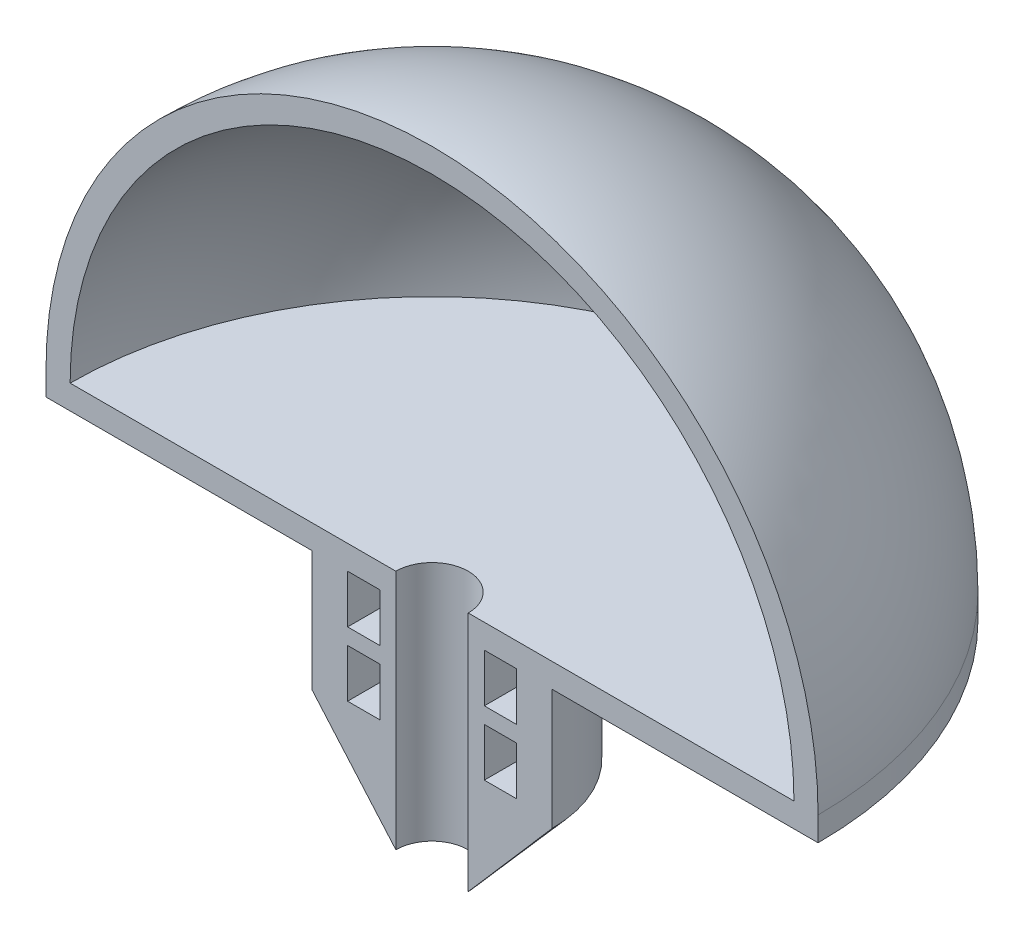
ISO-10303-21;
HEADER;
FILE_DESCRIPTION(('STEP AP214'),'2;1');
FILE_NAME('part.step','',(''),(''),'','','');
FILE_SCHEMA(('AUTOMOTIVE_DESIGN { 1 0 10303 214 1 1 1 1 }'));
ENDSEC;
DATA;
#1=APPLICATION_CONTEXT('core data for automotive mechanical design processes');
#2=APPLICATION_PROTOCOL_DEFINITION('international standard','automotive_design',2000,#1);
#3=PRODUCT_CONTEXT('',#1,'mechanical');
#4=PRODUCT('Part','Part','',(#3));
#5=PRODUCT_RELATED_PRODUCT_CATEGORY('part','',(#4));
#6=PRODUCT_DEFINITION_FORMATION('','',#4);
#7=PRODUCT_DEFINITION_CONTEXT('part definition',#1,'design');
#8=PRODUCT_DEFINITION('design','',#6,#7);
#9=PRODUCT_DEFINITION_SHAPE('','',#8);
#10=(LENGTH_UNIT() NAMED_UNIT(*) SI_UNIT(.MILLI.,.METRE.));
#11=(NAMED_UNIT(*) PLANE_ANGLE_UNIT() SI_UNIT($,.RADIAN.));
#12=(NAMED_UNIT(*) SI_UNIT($,.STERADIAN.) SOLID_ANGLE_UNIT());
#13=UNCERTAINTY_MEASURE_WITH_UNIT(LENGTH_MEASURE(1.E-05),#10,'distance_accuracy_value','');
#14=(GEOMETRIC_REPRESENTATION_CONTEXT(3) GLOBAL_UNCERTAINTY_ASSIGNED_CONTEXT((#13)) GLOBAL_UNIT_ASSIGNED_CONTEXT((#10,
#11,#12)) REPRESENTATION_CONTEXT('',''));
#15=CARTESIAN_POINT('',(0.,0.,0.));
#16=DIRECTION('',(0.,0.,1.));
#17=DIRECTION('',(1.,0.,0.));
#18=AXIS2_PLACEMENT_3D('',#15,#16,#17);
#19=CARTESIAN_POINT('',(-29.2821669392394,19.61740237691,0.));
#20=DIRECTION('',(0.,1.,0.));
#21=DIRECTION('',(-1.,0.,0.));
#22=AXIS2_PLACEMENT_3D('',#19,#20,#21);
#23=CYLINDRICAL_SURFACE('',#22,7.46637623437835);
#24=CARTESIAN_POINT('',(-29.2821669392393,-8.88259762308996,0.));
#25=DIRECTION('',(0.,-1.,0.));
#26=DIRECTION('',(0.,0.,-1.));
#27=AXIS2_PLACEMENT_3D('',#24,#25,#26);
#28=CIRCLE('',#27,7.46637623437835);
#29=CARTESIAN_POINT('',(-24.0321669392394,-8.88259762308996,-5.30888633079394));
#30=VERTEX_POINT('',#29);
#31=CARTESIAN_POINT('',(-34.5321669392394,-8.88259762308996,-5.30888633079377));
#32=VERTEX_POINT('',#31);
#33=EDGE_CURVE('E216',#30,#32,#28,.F.);
#34=ORIENTED_EDGE('',*,*,#33,.F.);
#35=DIRECTION('',(0.,1.,0.));
#36=VECTOR('',#35,1.);
#37=CARTESIAN_POINT('',(-24.0321669392394,19.61740237691,-5.30888633079388));
#38=LINE('',#37,#36);
#39=CARTESIAN_POINT('',(-24.0321669392394,-5.88259762308996,-5.30888633079393));
#40=VERTEX_POINT('',#39);
#41=EDGE_CURVE('E358',#40,#30,#38,.F.);
#42=ORIENTED_EDGE('',*,*,#41,.F.);
#43=CARTESIAN_POINT('',(-29.2821669392393,-5.88259762308998,0.));
#44=DIRECTION('',(0.,1.,0.));
#45=DIRECTION('',(-1.,0.,0.));
#46=AXIS2_PLACEMENT_3D('',#43,#44,#45);
#47=CIRCLE('',#46,7.46637623437834);
#48=CARTESIAN_POINT('',(-21.815790704861,-5.88259762308996,0.));
#49=VERTEX_POINT('',#48);
#50=EDGE_CURVE('E11',#49,#40,#47,.T.);
#51=ORIENTED_EDGE('',*,*,#50,.F.);
#52=DIRECTION('',(0.,-1.,0.));
#53=VECTOR('',#52,1.);
#54=CARTESIAN_POINT('',(-21.815790704861,-5.88259762308996,0.));
#55=LINE('',#54,#53);
#56=CARTESIAN_POINT('',(-21.815790704861,-13.3721147096549,0.));
#57=VERTEX_POINT('',#56);
#58=EDGE_CURVE('E240',#49,#57,#55,.T.);
#59=ORIENTED_EDGE('',*,*,#58,.T.);
#60=CARTESIAN_POINT('',(-29.2821669392393,-13.372114709655,0.));
#61=DIRECTION('',(0.,1.,0.));
#62=DIRECTION('',(-1.,0.,0.));
#63=AXIS2_PLACEMENT_3D('',#60,#61,#62);
#64=CIRCLE('',#63,7.46637623437836);
#65=CARTESIAN_POINT('',(-36.7485431736177,-13.372114709655,0.));
#66=VERTEX_POINT('',#65);
#67=EDGE_CURVE('E271',#57,#66,#64,.T.);
#68=ORIENTED_EDGE('',*,*,#67,.T.);
#69=DIRECTION('',(0.,-1.,0.));
#70=VECTOR('',#69,1.);
#71=CARTESIAN_POINT('',(-36.7485431736177,-5.88259762308999,0.));
#72=LINE('',#71,#70);
#73=CARTESIAN_POINT('',(-36.7485431736177,-5.88259762308999,0.));
#74=VERTEX_POINT('',#73);
#75=EDGE_CURVE('E220',#74,#66,#72,.T.);
#76=ORIENTED_EDGE('',*,*,#75,.F.);
#77=CARTESIAN_POINT('',(-34.5321669392394,-5.88259762308996,-5.30888633079376));
#78=VERTEX_POINT('',#77);
#79=EDGE_CURVE('E40',#78,#74,#47,.T.);
#80=ORIENTED_EDGE('',*,*,#79,.F.);
#81=DIRECTION('',(0.,1.,0.));
#82=VECTOR('',#81,1.);
#83=CARTESIAN_POINT('',(-34.5321669392394,19.61740237691,-5.30888633079383));
#84=LINE('',#83,#82);
#85=EDGE_CURVE('E218',#32,#78,#84,.T.);
#86=ORIENTED_EDGE('',*,*,#85,.F.);
#87=EDGE_LOOP('',(#34,#42,#51,#59,#68,#76,#80,#86));
#88=FACE_BOUND('',#87,.T.);
#89=CARTESIAN_POINT('',(-29.2821669392393,-9.88259762308996,0.));
#90=DIRECTION('',(0.,1.,0.));
#91=DIRECTION('',(-1.,0.,0.));
#92=AXIS2_PLACEMENT_3D('',#89,#90,#91);
#93=CIRCLE('',#92,7.46637623437835);
#94=CARTESIAN_POINT('',(-34.5321669392394,-9.88259762308996,-5.3088863307938));
#95=VERTEX_POINT('',#94);
#96=CARTESIAN_POINT('',(-24.0321669392394,-9.88259762308996,-5.30888633079384));
#97=VERTEX_POINT('',#96);
#98=EDGE_CURVE('E293',#95,#97,#93,.F.);
#99=ORIENTED_EDGE('',*,*,#98,.F.);
#100=DIRECTION('',(0.,1.,0.));
#101=VECTOR('',#100,1.);
#102=CARTESIAN_POINT('',(-34.5321669392394,19.61740237691,-5.30888633079387));
#103=LINE('',#102,#101);
#104=CARTESIAN_POINT('',(-34.5321669392394,-12.88259762309,-5.3088863307938));
#105=VERTEX_POINT('',#104);
#106=EDGE_CURVE('E296',#105,#95,#103,.T.);
#107=ORIENTED_EDGE('',*,*,#106,.F.);
#108=CARTESIAN_POINT('',(-29.2821669392393,-12.88259762309,0.));
#109=DIRECTION('',(0.,-1.,0.));
#110=DIRECTION('',(0.,0.,-1.));
#111=AXIS2_PLACEMENT_3D('',#108,#109,#110);
#112=CIRCLE('',#111,7.46637623437835);
#113=CARTESIAN_POINT('',(-24.0321669392394,-12.88259762309,-5.30888633079391));
#114=VERTEX_POINT('',#113);
#115=EDGE_CURVE('E336',#114,#105,#112,.F.);
#116=ORIENTED_EDGE('',*,*,#115,.F.);
#117=DIRECTION('',(0.,1.,0.));
#118=VECTOR('',#117,1.);
#119=CARTESIAN_POINT('',(-24.0321669392394,19.61740237691,-5.30888633079384));
#120=LINE('',#119,#118);
#121=EDGE_CURVE('E298',#97,#114,#120,.F.);
#122=ORIENTED_EDGE('',*,*,#121,.F.);
#123=EDGE_LOOP('',(#99,#107,#116,#122));
#124=FACE_BOUND('',#123,.T.);
#125=ADVANCED_FACE('F33',(#88,#124),#23,.T.);
#126=CARTESIAN_POINT('',(-29.2821669392393,-13.372114709655,0.));
#127=DIRECTION('',(0.,1.,0.));
#128=DIRECTION('',(-1.,0.,0.));
#129=AXIS2_PLACEMENT_3D('',#126,#127,#128);
#130=CONICAL_SURFACE('',#129,7.46637623437836,0.714783016965367);
#131=CARTESIAN_POINT('',(-29.2821669392393,-19.38259762309,0.));
#132=DIRECTION('',(0.,1.,0.));
#133=DIRECTION('',(-1.,0.,0.));
#134=AXIS2_PLACEMENT_3D('',#131,#132,#133);
#135=CIRCLE('',#134,2.25000000000011);
#136=CARTESIAN_POINT('',(-27.0321669392392,-19.38259762309,0.));
#137=VERTEX_POINT('',#136);
#138=CARTESIAN_POINT('',(-31.5321669392394,-19.38259762309,0.));
#139=VERTEX_POINT('',#138);
#140=EDGE_CURVE('E270',#137,#139,#135,.T.);
#141=ORIENTED_EDGE('',*,*,#140,.T.);
#142=DIRECTION('',(0.655453558841749,-0.755235481291555,0.));
#143=VECTOR('',#142,1.);
#144=CARTESIAN_POINT('',(-36.7485431736177,-13.372114709655,0.));
#145=LINE('',#144,#143);
#146=EDGE_CURVE('E223',#66,#139,#145,.T.);
#147=ORIENTED_EDGE('',*,*,#146,.F.);
#148=ORIENTED_EDGE('',*,*,#67,.F.);
#149=DIRECTION('',(-0.655453558841745,-0.755235481291558,0.));
#150=VECTOR('',#149,1.);
#151=CARTESIAN_POINT('',(-21.815790704861,-13.3721147096549,0.));
#152=LINE('',#151,#150);
#153=EDGE_CURVE('E243',#57,#137,#152,.T.);
#154=ORIENTED_EDGE('',*,*,#153,.T.);
#155=EDGE_LOOP('',(#141,#147,#148,#154));
#156=FACE_BOUND('',#155,.T.);
#157=ADVANCED_FACE('F290',(#156),#130,.T.);
#158=CARTESIAN_POINT('',(-29.2821669392394,19.61740237691,0.));
#159=DIRECTION('',(0.,1.,0.));
#160=DIRECTION('',(-1.,0.,0.));
#161=AXIS2_PLACEMENT_3D('',#158,#159,#160);
#162=CYLINDRICAL_SURFACE('',#161,2.25000000000009);
#163=CARTESIAN_POINT('',(-29.2821669392394,-4.38259762308996,0.));
#164=DIRECTION('',(0.,1.,0.));
#165=DIRECTION('',(-1.,0.,0.));
#166=AXIS2_PLACEMENT_3D('',#163,#164,#165);
#167=CIRCLE('',#166,2.25000000000008);
#168=CARTESIAN_POINT('',(-27.0321669392393,-4.38259762308996,0.));
#169=VERTEX_POINT('',#168);
#170=CARTESIAN_POINT('',(-31.5321669392394,-4.38259762308996,0.));
#171=VERTEX_POINT('',#170);
#172=EDGE_CURVE('E267',#169,#171,#167,.T.);
#173=ORIENTED_EDGE('',*,*,#172,.T.);
#174=DIRECTION('',(0.,1.,0.));
#175=VECTOR('',#174,1.);
#176=CARTESIAN_POINT('',(-31.5321669392394,-19.38259762309,0.));
#177=LINE('',#176,#175);
#178=EDGE_CURVE('E226',#139,#171,#177,.T.);
#179=ORIENTED_EDGE('',*,*,#178,.F.);
#180=ORIENTED_EDGE('',*,*,#140,.F.);
#181=DIRECTION('',(0.,1.,0.));
#182=VECTOR('',#181,1.);
#183=CARTESIAN_POINT('',(-27.0321669392392,-19.38259762309,0.));
#184=LINE('',#183,#182);
#185=EDGE_CURVE('E246',#137,#169,#184,.T.);
#186=ORIENTED_EDGE('',*,*,#185,.T.);
#187=EDGE_LOOP('',(#173,#179,#180,#186));
#188=FACE_BOUND('',#187,.T.);
#189=ADVANCED_FACE('F405',(#188),#162,.F.);
#190=CARTESIAN_POINT('',(-6.78216693923928,-4.38259762308989,1.57116660247942E-13));
#191=DIRECTION('',(0.,1.,0.));
#192=DIRECTION('',(-1.,0.,0.));
#193=AXIS2_PLACEMENT_3D('',#190,#191,#192);
#194=PLANE('',#193);
#195=CARTESIAN_POINT('',(-29.2821669392394,-4.38259762308992,0.));
#196=DIRECTION('',(0.,1.,0.));
#197=DIRECTION('',(-1.,0.,0.));
#198=AXIS2_PLACEMENT_3D('',#195,#196,#197);
#199=CIRCLE('',#198,22.5000000000001);
#200=CARTESIAN_POINT('',(-6.78216693923928,-4.38259762308986,1.57116660247942E-13));
#201=VERTEX_POINT('',#200);
#202=CARTESIAN_POINT('',(-51.7821669392394,-4.38259762308996,0.));
#203=VERTEX_POINT('',#202);
#204=EDGE_CURVE('E264',#201,#203,#199,.T.);
#205=ORIENTED_EDGE('',*,*,#204,.T.);
#206=DIRECTION('',(-1.,0.,0.));
#207=VECTOR('',#206,1.);
#208=CARTESIAN_POINT('',(-51.7821669392394,-4.38259762308996,0.));
#209=LINE('',#208,#207);
#210=EDGE_CURVE('E228',#171,#203,#209,.T.);
#211=ORIENTED_EDGE('',*,*,#210,.F.);
#212=ORIENTED_EDGE('',*,*,#172,.F.);
#213=DIRECTION('',(1.,0.,0.));
#214=VECTOR('',#213,1.);
#215=CARTESIAN_POINT('',(-6.78216693923928,-4.38259762308986,1.57116660247942E-13));
#216=LINE('',#215,#214);
#217=EDGE_CURVE('E248',#169,#201,#216,.T.);
#218=ORIENTED_EDGE('',*,*,#217,.T.);
#219=EDGE_LOOP('',(#205,#211,#212,#218));
#220=FACE_BOUND('',#219,.T.);
#221=ADVANCED_FACE('F401',(#220),#194,.T.);
#222=CARTESIAN_POINT('',(-29.2821669392393,-4.38259762308999,0.));
#223=DIRECTION('',(0.,1.,0.));
#224=DIRECTION('',(1.,0.,0.));
#225=AXIS2_PLACEMENT_3D('',#222,#223,#224);
#226=SPHERICAL_SURFACE('',#225,22.5);
#227=CARTESIAN_POINT('',(-29.2821669392393,-4.38259762308999,0.));
#228=DIRECTION('',(0.,0.,1.));
#229=DIRECTION('',(-1.,0.,0.));
#230=AXIS2_PLACEMENT_3D('',#227,#228,#229);
#231=CIRCLE('',#230,22.5);
#232=EDGE_CURVE('E251',#201,#203,#231,.T.);
#233=ORIENTED_EDGE('',*,*,#232,.T.);
#234=ORIENTED_EDGE('',*,*,#204,.F.);
#235=EDGE_LOOP('',(#233,#234));
#236=FACE_BOUND('',#235,.T.);
#237=ADVANCED_FACE('F397',(#236),#226,.F.);
#238=CARTESIAN_POINT('',(-29.2821669392393,-4.38259762308999,0.));
#239=DIRECTION('',(0.,1.,0.));
#240=DIRECTION('',(-1.,0.,0.));
#241=AXIS2_PLACEMENT_3D('',#238,#239,#240);
#242=SPHERICAL_SURFACE('',#241,24.);
#243=CARTESIAN_POINT('',(-29.2821669392394,-4.38259762308994,0.));
#244=DIRECTION('',(0.,1.,0.));
#245=DIRECTION('',(-1.,0.,0.));
#246=AXIS2_PLACEMENT_3D('',#243,#244,#245);
#247=CIRCLE('',#246,24.0000000000001);
#248=CARTESIAN_POINT('',(-5.28216693923927,-4.38259762308988,1.67591104264471E-13));
#249=VERTEX_POINT('',#248);
#250=CARTESIAN_POINT('',(-53.2821669392394,-4.38259762308999,0.));
#251=VERTEX_POINT('',#250);
#252=EDGE_CURVE('E261',#249,#251,#247,.T.);
#253=ORIENTED_EDGE('',*,*,#252,.T.);
#254=CARTESIAN_POINT('',(-29.2821669392393,-4.38259762308999,0.));
#255=DIRECTION('',(0.,0.,-1.));
#256=DIRECTION('',(1.,0.,0.));
#257=AXIS2_PLACEMENT_3D('',#254,#255,#256);
#258=CIRCLE('',#257,24.);
#259=EDGE_CURVE('E253',#251,#249,#258,.T.);
#260=ORIENTED_EDGE('',*,*,#259,.T.);
#261=EDGE_LOOP('',(#253,#260));
#262=FACE_BOUND('',#261,.T.);
#263=ADVANCED_FACE('F393',(#262),#242,.T.);
#264=CARTESIAN_POINT('',(-29.2821669392394,19.61740237691,0.));
#265=DIRECTION('',(0.,1.,0.));
#266=DIRECTION('',(-1.,0.,0.));
#267=AXIS2_PLACEMENT_3D('',#264,#265,#266);
#268=CYLINDRICAL_SURFACE('',#267,24.0000000000001);
#269=CARTESIAN_POINT('',(-29.2821669392393,-5.88259762308994,0.));
#270=DIRECTION('',(0.,1.,0.));
#271=DIRECTION('',(-1.,0.,0.));
#272=AXIS2_PLACEMENT_3D('',#269,#270,#271);
#273=CIRCLE('',#272,24.0000000000001);
#274=CARTESIAN_POINT('',(-5.28216693923927,-5.88259762308988,1.67591104264471E-13));
#275=VERTEX_POINT('',#274);
#276=CARTESIAN_POINT('',(-53.2821669392394,-5.88259762308999,0.));
#277=VERTEX_POINT('',#276);
#278=EDGE_CURVE('E259',#275,#277,#273,.T.);
#279=ORIENTED_EDGE('',*,*,#278,.T.);
#280=DIRECTION('',(0.,-1.,0.));
#281=VECTOR('',#280,1.);
#282=CARTESIAN_POINT('',(-53.2821669392394,-4.38259762308999,0.));
#283=LINE('',#282,#281);
#284=EDGE_CURVE('E231',#251,#277,#283,.T.);
#285=ORIENTED_EDGE('',*,*,#284,.F.);
#286=ORIENTED_EDGE('',*,*,#252,.F.);
#287=DIRECTION('',(0.,-1.,0.));
#288=VECTOR('',#287,1.);
#289=CARTESIAN_POINT('',(-5.28216693923927,-4.38259762308988,1.67591104264471E-13));
#290=LINE('',#289,#288);
#291=EDGE_CURVE('E256',#249,#275,#290,.T.);
#292=ORIENTED_EDGE('',*,*,#291,.T.);
#293=EDGE_LOOP('',(#279,#285,#286,#292));
#294=FACE_BOUND('',#293,.T.);
#295=ADVANCED_FACE('F385',(#294),#268,.T.);
#296=CARTESIAN_POINT('',(-5.28216693923927,-5.88259762308989,1.67591104264471E-13));
#297=DIRECTION('',(0.,-1.,0.));
#298=DIRECTION('',(1.,0.,0.));
#299=AXIS2_PLACEMENT_3D('',#296,#297,#298);
#300=PLANE('',#299);
#301=DIRECTION('',(1.,0.,0.));
#302=VECTOR('',#301,1.);
#303=CARTESIAN_POINT('',(-32.5321669392394,-5.88259762308994,-4.78314037999894));
#304=LINE('',#303,#302);
#305=CARTESIAN_POINT('',(-32.5321669392394,-5.88259762308994,-4.78314037999894));
#306=VERTEX_POINT('',#305);
#307=CARTESIAN_POINT('',(-26.0321669392394,-5.88259762308994,-4.78314037999894));
#308=VERTEX_POINT('',#307);
#309=EDGE_CURVE('E194',#306,#308,#304,.T.);
#310=ORIENTED_EDGE('',*,*,#309,.F.);
#311=DIRECTION('',(0.,0.,1.));
#312=VECTOR('',#311,1.);
#313=CARTESIAN_POINT('',(-32.5321669392394,-5.88259762308996,-15.));
#314=LINE('',#313,#312);
#315=CARTESIAN_POINT('',(-32.5321669392394,-5.88259762308996,0.));
#316=VERTEX_POINT('',#315);
#317=EDGE_CURVE('E201',#306,#316,#314,.T.);
#318=ORIENTED_EDGE('',*,*,#317,.T.);
#319=DIRECTION('',(-1.,0.,0.));
#320=VECTOR('',#319,1.);
#321=CARTESIAN_POINT('',(-34.5321669392394,-5.88259762308996,0.));
#322=LINE('',#321,#320);
#323=CARTESIAN_POINT('',(-34.5321669392394,-5.88259762308996,0.));
#324=VERTEX_POINT('',#323);
#325=EDGE_CURVE('E212',#316,#324,#322,.T.);
#326=ORIENTED_EDGE('',*,*,#325,.T.);
#327=DIRECTION('',(0.,0.,1.));
#328=VECTOR('',#327,1.);
#329=CARTESIAN_POINT('',(-34.5321669392394,-5.88259762308996,-15.));
#330=LINE('',#329,#328);
#331=EDGE_CURVE('E210',#78,#324,#330,.T.);
#332=ORIENTED_EDGE('',*,*,#331,.F.);
#333=ORIENTED_EDGE('',*,*,#79,.T.);
#334=DIRECTION('',(1.,0.,0.));
#335=VECTOR('',#334,1.);
#336=CARTESIAN_POINT('',(-53.2821669392394,-5.88259762308999,0.));
#337=LINE('',#336,#335);
#338=EDGE_CURVE('E234',#277,#74,#337,.T.);
#339=ORIENTED_EDGE('',*,*,#338,.F.);
#340=ORIENTED_EDGE('',*,*,#278,.F.);
#341=DIRECTION('',(-1.,0.,0.));
#342=VECTOR('',#341,1.);
#343=CARTESIAN_POINT('',(-15.315790704861,-5.88259762308993,0.));
#344=LINE('',#343,#342);
#345=EDGE_CURVE('E237',#275,#49,#344,.T.);
#346=ORIENTED_EDGE('',*,*,#345,.T.);
#347=ORIENTED_EDGE('',*,*,#50,.T.);
#348=DIRECTION('',(0.,0.,1.));
#349=VECTOR('',#348,1.);
#350=CARTESIAN_POINT('',(-24.0321669392394,-5.88259762308996,-15.));
#351=LINE('',#350,#349);
#352=CARTESIAN_POINT('',(-24.0321669392394,-5.88259762308996,0.));
#353=VERTEX_POINT('',#352);
#354=EDGE_CURVE('E359',#40,#353,#351,.T.);
#355=ORIENTED_EDGE('',*,*,#354,.T.);
#356=DIRECTION('',(-1.,0.,0.));
#357=VECTOR('',#356,1.);
#358=CARTESIAN_POINT('',(-26.0321669392394,-5.88259762308996,0.));
#359=LINE('',#358,#357);
#360=CARTESIAN_POINT('',(-26.0321669392394,-5.88259762308996,0.));
#361=VERTEX_POINT('',#360);
#362=EDGE_CURVE('E352',#353,#361,#359,.T.);
#363=ORIENTED_EDGE('',*,*,#362,.T.);
#364=DIRECTION('',(0.,0.,1.));
#365=VECTOR('',#364,1.);
#366=CARTESIAN_POINT('',(-26.0321669392394,-5.88259762308996,-15.));
#367=LINE('',#366,#365);
#368=EDGE_CURVE('E356',#308,#361,#367,.T.);
#369=ORIENTED_EDGE('',*,*,#368,.F.);
#370=EDGE_LOOP('',(#310,#318,#326,#332,#333,#339,#340,#346,#347,#355,#363,#369));
#371=FACE_BOUND('',#370,.T.);
#372=ADVANCED_FACE('F278',(#371),#300,.T.);
#373=CARTESIAN_POINT('',(-29.2821669392393,-4.38259762308999,0.));
#374=DIRECTION('',(0.,0.,-1.));
#375=DIRECTION('',(-1.,0.,0.));
#376=AXIS2_PLACEMENT_3D('',#373,#374,#375);
#377=PLANE('',#376);
#378=DIRECTION('',(1.,0.,0.));
#379=VECTOR('',#378,1.);
#380=CARTESIAN_POINT('',(-34.5321669392394,-12.88259762309,0.));
#381=LINE('',#380,#379);
#382=CARTESIAN_POINT('',(-34.5321669392394,-12.88259762309,0.));
#383=VERTEX_POINT('',#382);
#384=CARTESIAN_POINT('',(-32.5321669392394,-12.88259762309,0.));
#385=VERTEX_POINT('',#384);
#386=EDGE_CURVE('E446',#383,#385,#381,.T.);
#387=ORIENTED_EDGE('',*,*,#386,.F.);
#388=DIRECTION('',(0.,-1.,0.));
#389=VECTOR('',#388,1.);
#390=CARTESIAN_POINT('',(-34.5321669392394,-9.88259762308996,0.));
#391=LINE('',#390,#389);
#392=CARTESIAN_POINT('',(-34.5321669392394,-9.88259762308996,0.));
#393=VERTEX_POINT('',#392);
#394=EDGE_CURVE('E55',#393,#383,#391,.T.);
#395=ORIENTED_EDGE('',*,*,#394,.F.);
#396=DIRECTION('',(-1.,0.,0.));
#397=VECTOR('',#396,1.);
#398=CARTESIAN_POINT('',(-34.5321669392394,-9.88259762308996,0.));
#399=LINE('',#398,#397);
#400=CARTESIAN_POINT('',(-32.5321669392394,-9.88259762308996,0.));
#401=VERTEX_POINT('',#400);
#402=EDGE_CURVE('E312',#401,#393,#399,.T.);
#403=ORIENTED_EDGE('',*,*,#402,.F.);
#404=DIRECTION('',(0.,1.,0.));
#405=VECTOR('',#404,1.);
#406=CARTESIAN_POINT('',(-32.5321669392394,-9.88259762308996,0.));
#407=LINE('',#406,#405);
#408=EDGE_CURVE('E448',#385,#401,#407,.T.);
#409=ORIENTED_EDGE('',*,*,#408,.F.);
#410=EDGE_LOOP('',(#387,#395,#403,#409));
#411=FACE_BOUND('',#410,.T.);
#412=DIRECTION('',(1.,0.,0.));
#413=VECTOR('',#412,1.);
#414=CARTESIAN_POINT('',(-26.0321669392394,-12.88259762309,0.));
#415=LINE('',#414,#413);
#416=CARTESIAN_POINT('',(-26.0321669392394,-12.88259762309,0.));
#417=VERTEX_POINT('',#416);
#418=CARTESIAN_POINT('',(-24.0321669392394,-12.88259762309,0.));
#419=VERTEX_POINT('',#418);
#420=EDGE_CURVE('E324',#417,#419,#415,.T.);
#421=ORIENTED_EDGE('',*,*,#420,.F.);
#422=DIRECTION('',(0.,-1.,0.));
#423=VECTOR('',#422,1.);
#424=CARTESIAN_POINT('',(-26.0321669392394,-9.88259762308996,0.));
#425=LINE('',#424,#423);
#426=CARTESIAN_POINT('',(-26.0321669392394,-9.88259762308996,0.));
#427=VERTEX_POINT('',#426);
#428=EDGE_CURVE('E308',#427,#417,#425,.T.);
#429=ORIENTED_EDGE('',*,*,#428,.F.);
#430=DIRECTION('',(-1.,0.,0.));
#431=VECTOR('',#430,1.);
#432=CARTESIAN_POINT('',(-26.0321669392394,-9.88259762308996,0.));
#433=LINE('',#432,#431);
#434=CARTESIAN_POINT('',(-24.0321669392394,-9.88259762308996,0.));
#435=VERTEX_POINT('',#434);
#436=EDGE_CURVE('E330',#435,#427,#433,.T.);
#437=ORIENTED_EDGE('',*,*,#436,.F.);
#438=DIRECTION('',(0.,1.,0.));
#439=VECTOR('',#438,1.);
#440=CARTESIAN_POINT('',(-24.0321669392394,-9.88259762308996,0.));
#441=LINE('',#440,#439);
#442=EDGE_CURVE('E327',#419,#435,#441,.T.);
#443=ORIENTED_EDGE('',*,*,#442,.F.);
#444=EDGE_LOOP('',(#421,#429,#437,#443));
#445=FACE_BOUND('',#444,.T.);
#446=DIRECTION('',(1.,0.,0.));
#447=VECTOR('',#446,1.);
#448=CARTESIAN_POINT('',(-26.0321669392394,-8.88259762308996,0.));
#449=LINE('',#448,#447);
#450=CARTESIAN_POINT('',(-26.0321669392394,-8.88259762308996,0.));
#451=VERTEX_POINT('',#450);
#452=CARTESIAN_POINT('',(-24.0321669392394,-8.88259762308996,0.));
#453=VERTEX_POINT('',#452);
#454=EDGE_CURVE('E346',#451,#453,#449,.T.);
#455=ORIENTED_EDGE('',*,*,#454,.F.);
#456=DIRECTION('',(0.,-1.,0.));
#457=VECTOR('',#456,1.);
#458=CARTESIAN_POINT('',(-26.0321669392394,-5.88259762308996,0.));
#459=LINE('',#458,#457);
#460=EDGE_CURVE('E302',#361,#451,#459,.T.);
#461=ORIENTED_EDGE('',*,*,#460,.F.);
#462=ORIENTED_EDGE('',*,*,#362,.F.);
#463=DIRECTION('',(0.,1.,0.));
#464=VECTOR('',#463,1.);
#465=CARTESIAN_POINT('',(-24.0321669392394,-5.88259762308996,0.));
#466=LINE('',#465,#464);
#467=EDGE_CURVE('E349',#453,#353,#466,.T.);
#468=ORIENTED_EDGE('',*,*,#467,.F.);
#469=EDGE_LOOP('',(#455,#461,#462,#468));
#470=FACE_BOUND('',#469,.T.);
#471=DIRECTION('',(1.,0.,0.));
#472=VECTOR('',#471,1.);
#473=CARTESIAN_POINT('',(-34.5321669392394,-8.88259762308996,0.));
#474=LINE('',#473,#472);
#475=CARTESIAN_POINT('',(-34.5321669392394,-8.88259762308996,0.));
#476=VERTEX_POINT('',#475);
#477=CARTESIAN_POINT('',(-32.5321669392394,-8.88259762308996,0.));
#478=VERTEX_POINT('',#477);
#479=EDGE_CURVE('E206',#476,#478,#474,.T.);
#480=ORIENTED_EDGE('',*,*,#479,.F.);
#481=DIRECTION('',(0.,-1.,0.));
#482=VECTOR('',#481,1.);
#483=CARTESIAN_POINT('',(-34.5321669392394,-5.88259762308996,0.));
#484=LINE('',#483,#482);
#485=EDGE_CURVE('E366',#324,#476,#484,.T.);
#486=ORIENTED_EDGE('',*,*,#485,.F.);
#487=ORIENTED_EDGE('',*,*,#325,.F.);
#488=DIRECTION('',(0.,1.,0.));
#489=VECTOR('',#488,1.);
#490=CARTESIAN_POINT('',(-32.5321669392394,-5.88259762308996,0.));
#491=LINE('',#490,#489);
#492=EDGE_CURVE('E369',#478,#316,#491,.T.);
#493=ORIENTED_EDGE('',*,*,#492,.F.);
#494=EDGE_LOOP('',(#480,#486,#487,#493));
#495=FACE_BOUND('',#494,.T.);
#496=ORIENTED_EDGE('',*,*,#345,.F.);
#497=ORIENTED_EDGE('',*,*,#291,.F.);
#498=ORIENTED_EDGE('',*,*,#259,.F.);
#499=ORIENTED_EDGE('',*,*,#284,.T.);
#500=ORIENTED_EDGE('',*,*,#338,.T.);
#501=ORIENTED_EDGE('',*,*,#75,.T.);
#502=ORIENTED_EDGE('',*,*,#146,.T.);
#503=ORIENTED_EDGE('',*,*,#178,.T.);
#504=ORIENTED_EDGE('',*,*,#210,.T.);
#505=ORIENTED_EDGE('',*,*,#232,.F.);
#506=ORIENTED_EDGE('',*,*,#217,.F.);
#507=ORIENTED_EDGE('',*,*,#185,.F.);
#508=ORIENTED_EDGE('',*,*,#153,.F.);
#509=ORIENTED_EDGE('',*,*,#58,.F.);
#510=EDGE_LOOP('',(#496,#497,#498,#499,#500,#501,#502,#503,#504,#505,#506,#507,#508,#509));
#511=FACE_BOUND('',#510,.T.);
#512=ADVANCED_FACE('F283',(#411,#445,#470,#495,#511),#377,.F.);
#513=CARTESIAN_POINT('',(-34.5321669392394,-5.88259762308996,-15.));
#514=DIRECTION('',(-1.,0.,0.));
#515=DIRECTION('',(0.,0.,1.));
#516=AXIS2_PLACEMENT_3D('',#513,#514,#515);
#517=PLANE('',#516);
#518=ORIENTED_EDGE('',*,*,#85,.T.);
#519=ORIENTED_EDGE('',*,*,#331,.T.);
#520=ORIENTED_EDGE('',*,*,#485,.T.);
#521=DIRECTION('',(0.,0.,1.));
#522=VECTOR('',#521,1.);
#523=CARTESIAN_POINT('',(-34.5321669392394,-8.88259762308996,-15.));
#524=LINE('',#523,#522);
#525=EDGE_CURVE('E208',#32,#476,#524,.T.);
#526=ORIENTED_EDGE('',*,*,#525,.F.);
#527=EDGE_LOOP('',(#518,#519,#520,#526));
#528=FACE_BOUND('',#527,.T.);
#529=ADVANCED_FACE('F372',(#528),#517,.F.);
#530=CARTESIAN_POINT('',(-32.5321669392394,-5.88259762308996,-15.));
#531=DIRECTION('',(1.,0.,0.));
#532=DIRECTION('',(0.,0.,-1.));
#533=AXIS2_PLACEMENT_3D('',#530,#531,#532);
#534=PLANE('',#533);
#535=ORIENTED_EDGE('',*,*,#317,.F.);
#536=DIRECTION('',(0.,-1.,0.));
#537=VECTOR('',#536,1.);
#538=CARTESIAN_POINT('',(-32.5321669392394,-8.88259762308996,-4.78314037999894));
#539=LINE('',#538,#537);
#540=CARTESIAN_POINT('',(-32.5321669392394,-8.88259762308996,-4.78314037999894));
#541=VERTEX_POINT('',#540);
#542=EDGE_CURVE('E189',#306,#541,#539,.T.);
#543=ORIENTED_EDGE('',*,*,#542,.T.);
#544=DIRECTION('',(0.,0.,1.));
#545=VECTOR('',#544,1.);
#546=CARTESIAN_POINT('',(-32.5321669392394,-8.88259762308996,-15.));
#547=LINE('',#546,#545);
#548=EDGE_CURVE('E199',#541,#478,#547,.T.);
#549=ORIENTED_EDGE('',*,*,#548,.T.);
#550=ORIENTED_EDGE('',*,*,#492,.T.);
#551=EDGE_LOOP('',(#535,#543,#549,#550));
#552=FACE_BOUND('',#551,.T.);
#553=ADVANCED_FACE('F197',(#552),#534,.F.);
#554=CARTESIAN_POINT('',(-34.5321669392394,-8.88259762308996,-15.));
#555=DIRECTION('',(0.,-1.,0.));
#556=DIRECTION('',(0.,0.,-1.));
#557=AXIS2_PLACEMENT_3D('',#554,#555,#556);
#558=PLANE('',#557);
#559=ORIENTED_EDGE('',*,*,#33,.T.);
#560=ORIENTED_EDGE('',*,*,#525,.T.);
#561=ORIENTED_EDGE('',*,*,#479,.T.);
#562=ORIENTED_EDGE('',*,*,#548,.F.);
#563=DIRECTION('',(1.,0.,0.));
#564=VECTOR('',#563,1.);
#565=CARTESIAN_POINT('',(-32.5321669392394,-8.88259762308996,-4.78314037999894));
#566=LINE('',#565,#564);
#567=CARTESIAN_POINT('',(-26.0321669392394,-8.88259762308996,-4.78314037999894));
#568=VERTEX_POINT('',#567);
#569=EDGE_CURVE('E186',#541,#568,#566,.T.);
#570=ORIENTED_EDGE('',*,*,#569,.T.);
#571=DIRECTION('',(0.,0.,1.));
#572=VECTOR('',#571,1.);
#573=CARTESIAN_POINT('',(-26.0321669392394,-8.88259762308996,-15.));
#574=LINE('',#573,#572);
#575=EDGE_CURVE('E355',#568,#451,#574,.T.);
#576=ORIENTED_EDGE('',*,*,#575,.T.);
#577=ORIENTED_EDGE('',*,*,#454,.T.);
#578=DIRECTION('',(0.,0.,1.));
#579=VECTOR('',#578,1.);
#580=CARTESIAN_POINT('',(-24.0321669392394,-8.88259762308996,-15.));
#581=LINE('',#580,#579);
#582=EDGE_CURVE('E361',#30,#453,#581,.T.);
#583=ORIENTED_EDGE('',*,*,#582,.F.);
#584=EDGE_LOOP('',(#559,#560,#561,#562,#570,#576,#577,#583));
#585=FACE_BOUND('',#584,.T.);
#586=ADVANCED_FACE('F203',(#585),#558,.F.);
#587=CARTESIAN_POINT('',(-26.0321669392394,-5.88259762308996,-15.));
#588=DIRECTION('',(-1.,0.,0.));
#589=DIRECTION('',(0.,0.,1.));
#590=AXIS2_PLACEMENT_3D('',#587,#588,#589);
#591=PLANE('',#590);
#592=ORIENTED_EDGE('',*,*,#575,.F.);
#593=DIRECTION('',(0.,-1.,0.));
#594=VECTOR('',#593,1.);
#595=CARTESIAN_POINT('',(-26.0321669392394,-8.88259762308996,-4.78314037999894));
#596=LINE('',#595,#594);
#597=EDGE_CURVE('E47',#308,#568,#596,.T.);
#598=ORIENTED_EDGE('',*,*,#597,.F.);
#599=ORIENTED_EDGE('',*,*,#368,.T.);
#600=ORIENTED_EDGE('',*,*,#460,.T.);
#601=EDGE_LOOP('',(#592,#598,#599,#600));
#602=FACE_BOUND('',#601,.T.);
#603=ADVANCED_FACE('F431',(#602),#591,.F.);
#604=CARTESIAN_POINT('',(-24.0321669392394,-5.88259762308996,-15.));
#605=DIRECTION('',(1.,0.,0.));
#606=DIRECTION('',(0.,0.,-1.));
#607=AXIS2_PLACEMENT_3D('',#604,#605,#606);
#608=PLANE('',#607);
#609=ORIENTED_EDGE('',*,*,#41,.T.);
#610=ORIENTED_EDGE('',*,*,#582,.T.);
#611=ORIENTED_EDGE('',*,*,#467,.T.);
#612=ORIENTED_EDGE('',*,*,#354,.F.);
#613=EDGE_LOOP('',(#609,#610,#611,#612));
#614=FACE_BOUND('',#613,.T.);
#615=ADVANCED_FACE('F427',(#614),#608,.F.);
#616=CARTESIAN_POINT('',(-26.0321669392394,-9.88259762308996,-15.));
#617=DIRECTION('',(-1.,0.,0.));
#618=DIRECTION('',(0.,0.,1.));
#619=AXIS2_PLACEMENT_3D('',#616,#617,#618);
#620=PLANE('',#619);
#621=DIRECTION('',(0.,0.,1.));
#622=VECTOR('',#621,1.);
#623=CARTESIAN_POINT('',(-26.0321669392394,-12.88259762309,-15.));
#624=LINE('',#623,#622);
#625=CARTESIAN_POINT('',(-26.0321669392394,-12.88259762309,-4.78314037999894));
#626=VERTEX_POINT('',#625);
#627=EDGE_CURVE('E333',#626,#417,#624,.T.);
#628=ORIENTED_EDGE('',*,*,#627,.F.);
#629=DIRECTION('',(0.,-1.,0.));
#630=VECTOR('',#629,1.);
#631=CARTESIAN_POINT('',(-26.0321669392394,-12.88259762309,-4.78314037999894));
#632=LINE('',#631,#630);
#633=CARTESIAN_POINT('',(-26.0321669392394,-9.88259762308996,-4.78314037999894));
#634=VERTEX_POINT('',#633);
#635=EDGE_CURVE('E432',#634,#626,#632,.T.);
#636=ORIENTED_EDGE('',*,*,#635,.F.);
#637=DIRECTION('',(0.,0.,1.));
#638=VECTOR('',#637,1.);
#639=CARTESIAN_POINT('',(-26.0321669392394,-9.88259762308996,-15.));
#640=LINE('',#639,#638);
#641=EDGE_CURVE('E334',#634,#427,#640,.T.);
#642=ORIENTED_EDGE('',*,*,#641,.T.);
#643=ORIENTED_EDGE('',*,*,#428,.T.);
#644=EDGE_LOOP('',(#628,#636,#642,#643));
#645=FACE_BOUND('',#644,.T.);
#646=ADVANCED_FACE('F466',(#645),#620,.F.);
#647=CARTESIAN_POINT('',(-26.0321669392394,-9.88259762308996,-15.));
#648=DIRECTION('',(0.,1.,0.));
#649=DIRECTION('',(-1.,0.,0.));
#650=AXIS2_PLACEMENT_3D('',#647,#648,#649);
#651=PLANE('',#650);
#652=ORIENTED_EDGE('',*,*,#98,.T.);
#653=DIRECTION('',(0.,0.,1.));
#654=VECTOR('',#653,1.);
#655=CARTESIAN_POINT('',(-24.0321669392394,-9.88259762308996,-15.));
#656=LINE('',#655,#654);
#657=EDGE_CURVE('E337',#97,#435,#656,.T.);
#658=ORIENTED_EDGE('',*,*,#657,.T.);
#659=ORIENTED_EDGE('',*,*,#436,.T.);
#660=ORIENTED_EDGE('',*,*,#641,.F.);
#661=DIRECTION('',(1.,0.,0.));
#662=VECTOR('',#661,1.);
#663=CARTESIAN_POINT('',(-32.5321669392394,-9.88259762308996,-4.78314037999894));
#664=LINE('',#663,#662);
#665=CARTESIAN_POINT('',(-32.5321669392394,-9.88259762308996,-4.78314037999894));
#666=VERTEX_POINT('',#665);
#667=EDGE_CURVE('E442',#666,#634,#664,.T.);
#668=ORIENTED_EDGE('',*,*,#667,.F.);
#669=DIRECTION('',(0.,0.,1.));
#670=VECTOR('',#669,1.);
#671=CARTESIAN_POINT('',(-32.5321669392394,-9.88259762308996,-15.));
#672=LINE('',#671,#670);
#673=EDGE_CURVE('E313',#666,#401,#672,.T.);
#674=ORIENTED_EDGE('',*,*,#673,.T.);
#675=ORIENTED_EDGE('',*,*,#402,.T.);
#676=DIRECTION('',(0.,0.,1.));
#677=VECTOR('',#676,1.);
#678=CARTESIAN_POINT('',(-34.5321669392394,-9.88259762308996,-15.));
#679=LINE('',#678,#677);
#680=EDGE_CURVE('E305',#95,#393,#679,.T.);
#681=ORIENTED_EDGE('',*,*,#680,.F.);
#682=EDGE_LOOP('',(#652,#658,#659,#660,#668,#674,#675,#681));
#683=FACE_BOUND('',#682,.T.);
#684=ADVANCED_FACE('F310',(#683),#651,.F.);
#685=CARTESIAN_POINT('',(-24.0321669392394,-9.88259762308996,-15.));
#686=DIRECTION('',(1.,0.,0.));
#687=DIRECTION('',(0.,0.,-1.));
#688=AXIS2_PLACEMENT_3D('',#685,#686,#687);
#689=PLANE('',#688);
#690=ORIENTED_EDGE('',*,*,#121,.T.);
#691=DIRECTION('',(0.,0.,1.));
#692=VECTOR('',#691,1.);
#693=CARTESIAN_POINT('',(-24.0321669392394,-12.88259762309,-15.));
#694=LINE('',#693,#692);
#695=EDGE_CURVE('E339',#114,#419,#694,.T.);
#696=ORIENTED_EDGE('',*,*,#695,.T.);
#697=ORIENTED_EDGE('',*,*,#442,.T.);
#698=ORIENTED_EDGE('',*,*,#657,.F.);
#699=EDGE_LOOP('',(#690,#696,#697,#698));
#700=FACE_BOUND('',#699,.T.);
#701=ADVANCED_FACE('F460',(#700),#689,.F.);
#702=CARTESIAN_POINT('',(-26.0321669392394,-12.88259762309,-15.));
#703=DIRECTION('',(0.,-1.,0.));
#704=DIRECTION('',(0.,0.,-1.));
#705=AXIS2_PLACEMENT_3D('',#702,#703,#704);
#706=PLANE('',#705);
#707=ORIENTED_EDGE('',*,*,#115,.T.);
#708=DIRECTION('',(0.,0.,1.));
#709=VECTOR('',#708,1.);
#710=CARTESIAN_POINT('',(-34.5321669392394,-12.88259762309,-15.));
#711=LINE('',#710,#709);
#712=EDGE_CURVE('E307',#105,#383,#711,.T.);
#713=ORIENTED_EDGE('',*,*,#712,.T.);
#714=ORIENTED_EDGE('',*,*,#386,.T.);
#715=DIRECTION('',(0.,0.,1.));
#716=VECTOR('',#715,1.);
#717=CARTESIAN_POINT('',(-32.5321669392394,-12.88259762309,-15.));
#718=LINE('',#717,#716);
#719=CARTESIAN_POINT('',(-32.5321669392394,-12.88259762309,-4.78314037999894));
#720=VERTEX_POINT('',#719);
#721=EDGE_CURVE('E315',#720,#385,#718,.T.);
#722=ORIENTED_EDGE('',*,*,#721,.F.);
#723=DIRECTION('',(1.,0.,0.));
#724=VECTOR('',#723,1.);
#725=CARTESIAN_POINT('',(-32.5321669392394,-12.88259762309,-4.78314037999894));
#726=LINE('',#725,#724);
#727=EDGE_CURVE('E440',#720,#626,#726,.T.);
#728=ORIENTED_EDGE('',*,*,#727,.T.);
#729=ORIENTED_EDGE('',*,*,#627,.T.);
#730=ORIENTED_EDGE('',*,*,#420,.T.);
#731=ORIENTED_EDGE('',*,*,#695,.F.);
#732=EDGE_LOOP('',(#707,#713,#714,#722,#728,#729,#730,#731));
#733=FACE_BOUND('',#732,.T.);
#734=ADVANCED_FACE('F456',(#733),#706,.F.);
#735=CARTESIAN_POINT('',(-34.5321669392394,-9.88259762308996,-15.));
#736=DIRECTION('',(-1.,0.,0.));
#737=DIRECTION('',(0.,0.,1.));
#738=AXIS2_PLACEMENT_3D('',#735,#736,#737);
#739=PLANE('',#738);
#740=ORIENTED_EDGE('',*,*,#106,.T.);
#741=ORIENTED_EDGE('',*,*,#680,.T.);
#742=ORIENTED_EDGE('',*,*,#394,.T.);
#743=ORIENTED_EDGE('',*,*,#712,.F.);
#744=EDGE_LOOP('',(#740,#741,#742,#743));
#745=FACE_BOUND('',#744,.T.);
#746=ADVANCED_FACE('F304',(#745),#739,.F.);
#747=CARTESIAN_POINT('',(-32.5321669392394,-9.88259762308996,-15.));
#748=DIRECTION('',(1.,0.,0.));
#749=DIRECTION('',(0.,0.,-1.));
#750=AXIS2_PLACEMENT_3D('',#747,#748,#749);
#751=PLANE('',#750);
#752=ORIENTED_EDGE('',*,*,#673,.F.);
#753=DIRECTION('',(0.,-1.,0.));
#754=VECTOR('',#753,1.);
#755=CARTESIAN_POINT('',(-32.5321669392394,-12.88259762309,-4.78314037999894));
#756=LINE('',#755,#754);
#757=EDGE_CURVE('E435',#666,#720,#756,.T.);
#758=ORIENTED_EDGE('',*,*,#757,.T.);
#759=ORIENTED_EDGE('',*,*,#721,.T.);
#760=ORIENTED_EDGE('',*,*,#408,.T.);
#761=EDGE_LOOP('',(#752,#758,#759,#760));
#762=FACE_BOUND('',#761,.T.);
#763=ADVANCED_FACE('F453',(#762),#751,.F.);
#764=CARTESIAN_POINT('',(-32.5321669392394,-12.88259762309,-4.78314037999894));
#765=DIRECTION('',(0.,0.,1.));
#766=DIRECTION('',(1.,0.,0.));
#767=AXIS2_PLACEMENT_3D('',#764,#765,#766);
#768=PLANE('',#767);
#769=ORIENTED_EDGE('',*,*,#635,.T.);
#770=ORIENTED_EDGE('',*,*,#727,.F.);
#771=ORIENTED_EDGE('',*,*,#757,.F.);
#772=ORIENTED_EDGE('',*,*,#667,.T.);
#773=EDGE_LOOP('',(#769,#770,#771,#772));
#774=FACE_BOUND('',#773,.T.);
#775=ADVANCED_FACE('F469',(#774),#768,.F.);
#776=CARTESIAN_POINT('',(-32.5321669392394,-8.88259762308996,-4.78314037999894));
#777=DIRECTION('',(0.,0.,1.));
#778=DIRECTION('',(1.,0.,0.));
#779=AXIS2_PLACEMENT_3D('',#776,#777,#778);
#780=PLANE('',#779);
#781=ORIENTED_EDGE('',*,*,#597,.T.);
#782=ORIENTED_EDGE('',*,*,#569,.F.);
#783=ORIENTED_EDGE('',*,*,#542,.F.);
#784=ORIENTED_EDGE('',*,*,#309,.T.);
#785=EDGE_LOOP('',(#781,#782,#783,#784));
#786=FACE_BOUND('',#785,.T.);
#787=ADVANCED_FACE('F188',(#786),#780,.F.);
#788=CLOSED_SHELL('',(#125,#157,#189,#221,#237,#263,#295,#372,#512,#529,#553,#586,#603,#615,
#646,#684,#701,#734,#746,#763,#775,#787));
#789=MANIFOLD_SOLID_BREP('B2',#788);
#790=ADVANCED_BREP_SHAPE_REPRESENTATION('',(#18,#789),#14);
#791=SHAPE_DEFINITION_REPRESENTATION(#9,#790);
ENDSEC;
END-ISO-10303-21;
